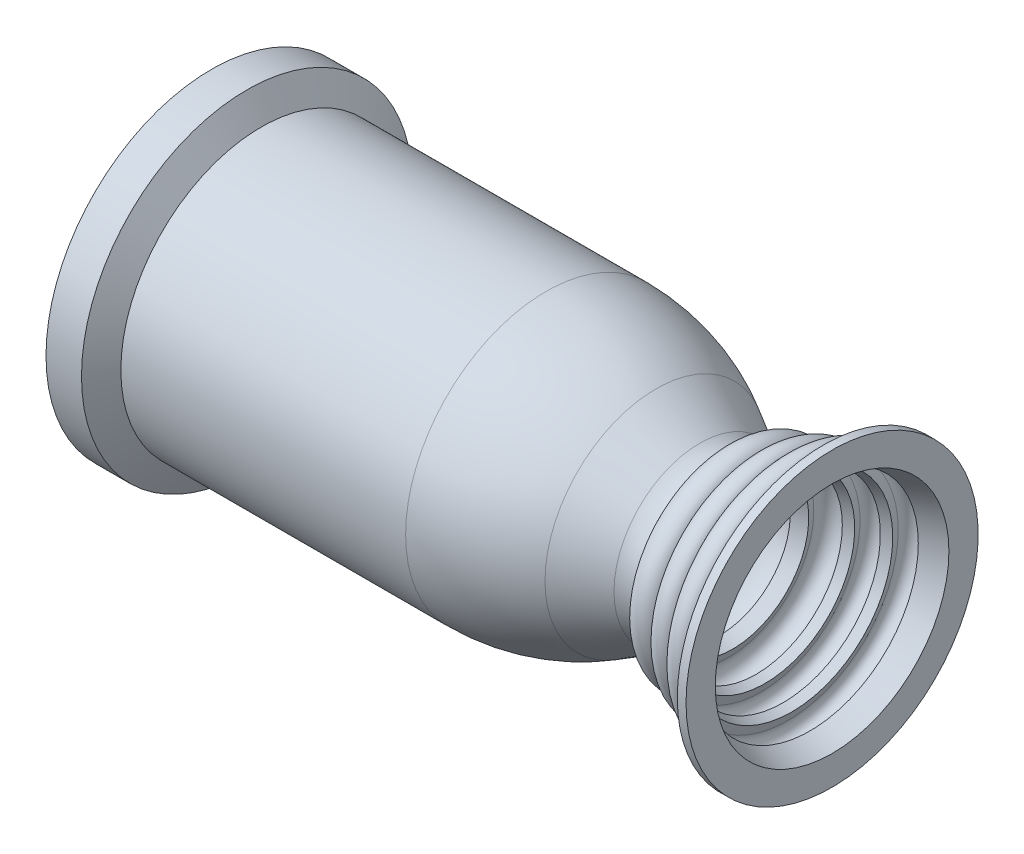
ISO-10303-21;
HEADER;
FILE_DESCRIPTION(('STEP AP214'),'2;1');
FILE_NAME('part.step','',(''),(''),'','','');
FILE_SCHEMA(('AUTOMOTIVE_DESIGN { 1 0 10303 214 1 1 1 1 }'));
ENDSEC;
DATA;
#1=APPLICATION_CONTEXT('core data for automotive mechanical design processes');
#2=APPLICATION_PROTOCOL_DEFINITION('international standard','automotive_design',2000,#1);
#3=PRODUCT_CONTEXT('',#1,'mechanical');
#4=PRODUCT('Part','Part','',(#3));
#5=PRODUCT_RELATED_PRODUCT_CATEGORY('part','',(#4));
#6=PRODUCT_DEFINITION_FORMATION('','',#4);
#7=PRODUCT_DEFINITION_CONTEXT('part definition',#1,'design');
#8=PRODUCT_DEFINITION('design','',#6,#7);
#9=PRODUCT_DEFINITION_SHAPE('','',#8);
#10=(LENGTH_UNIT() NAMED_UNIT(*) SI_UNIT(.MILLI.,.METRE.));
#11=(NAMED_UNIT(*) PLANE_ANGLE_UNIT() SI_UNIT($,.RADIAN.));
#12=(NAMED_UNIT(*) SI_UNIT($,.STERADIAN.) SOLID_ANGLE_UNIT());
#13=UNCERTAINTY_MEASURE_WITH_UNIT(LENGTH_MEASURE(1.E-05),#10,'distance_accuracy_value','');
#14=(GEOMETRIC_REPRESENTATION_CONTEXT(3) GLOBAL_UNCERTAINTY_ASSIGNED_CONTEXT((#13)) GLOBAL_UNIT_ASSIGNED_CONTEXT((#10,
#11,#12)) REPRESENTATION_CONTEXT('',''));
#15=CARTESIAN_POINT('',(0.,0.,0.));
#16=DIRECTION('',(0.,0.,1.));
#17=DIRECTION('',(1.,0.,0.));
#18=AXIS2_PLACEMENT_3D('',#15,#16,#17);
#19=CARTESIAN_POINT('',(233.125452234531,35.6896689820034,0.));
#20=CARTESIAN_POINT('',(235.982927375537,36.9612284286919,0.));
#21=CARTESIAN_POINT('',(241.720728584247,39.4887823874572,0.));
#22=CARTESIAN_POINT('',(253.127754110023,44.4104041223226,0.));
#23=CARTESIAN_POINT('',(267.331680591798,50.3448823112272,0.));
#24=CARTESIAN_POINT('',(284.265598041765,57.1077053295556,0.));
#25=CARTESIAN_POINT('',(301.09514510302,63.5145776102163,0.));
#26=CARTESIAN_POINT('',(317.818383555474,69.5644426879412,0.));
#27=CARTESIAN_POINT('',(334.43732724022,75.2577108387173,0.));
#28=CARTESIAN_POINT('',(348.194959969697,79.7033627843176,0.));
#29=CARTESIAN_POINT('',(359.156425704374,83.0835170429566,0.));
#30=CARTESIAN_POINT('',(364.604957843719,84.7096985060822,0.));
#31=CARTESIAN_POINT('',(367.338810320537,85.5119851472337,0.));
#32=B_SPLINE_CURVE_WITH_KNOTS('',3,(#19,#20,#21,#22,#23,#24,#25,#26,#27,#28,#29,#30,#31),
.UNSPECIFIED.,.F.,.F.,(4,1,1,1,1,1,1,1,1,1,4),(0.49285898927238,0.492966882127899,
0.493074774983417,0.493290560694453,0.493506346405489,0.493722132116525,0.493937917827561,
0.494153703538597,0.494369489249633,0.494477382105151,0.494585274960669),.UNSPECIFIED.);
#33=CARTESIAN_POINT('',(0.,0.,0.));
#34=DIRECTION('',(-1.,0.,0.));
#35=AXIS1_PLACEMENT('',#33,#34);
#36=SURFACE_OF_REVOLUTION('',#32,#35);
#37=CARTESIAN_POINT('',(233.424633520371,0.,0.));
#38=DIRECTION('',(-1.,0.,0.));
#39=DIRECTION('',(0.,0.,1.));
#40=AXIS2_PLACEMENT_3D('',#37,#38,#39);
#41=CIRCLE('',#40,35.8227558713126);
#42=CARTESIAN_POINT('',(233.424633520371,0.,35.8227558713126));
#43=VERTEX_POINT('',#42);
#44=EDGE_CURVE('E276',#43,#43,#41,.T.);
#45=ORIENTED_EDGE('',*,*,#44,.T.);
#46=EDGE_LOOP('',(#45));
#47=FACE_BOUND('',#46,.T.);
#48=CARTESIAN_POINT('',(239.924838451428,0.,0.));
#49=DIRECTION('',(-1.,0.,0.));
#50=DIRECTION('',(0.,0.,1.));
#51=AXIS2_PLACEMENT_3D('',#48,#49,#50);
#52=CIRCLE('',#51,38.6911516360315);
#53=CARTESIAN_POINT('',(239.924838451428,0.,38.6911516360315));
#54=VERTEX_POINT('',#53);
#55=EDGE_CURVE('E44',#54,#54,#52,.T.);
#56=ORIENTED_EDGE('',*,*,#55,.F.);
#57=EDGE_LOOP('',(#56));
#58=FACE_BOUND('',#57,.T.);
#59=ADVANCED_FACE('F40',(#47,#58),#36,.T.);
#60=CARTESIAN_POINT('',(290.485999999995,0.,0.));
#61=DIRECTION('',(-1.,0.,0.));
#62=DIRECTION('',(0.,0.,1.));
#63=AXIS2_PLACEMENT_3D('',#60,#61,#62);
#64=CIRCLE('',#63,59.4599083801213);
#65=CARTESIAN_POINT('',(290.485999999995,0.,59.4599083801213));
#66=VERTEX_POINT('',#65);
#67=EDGE_CURVE('E102',#66,#66,#64,.F.);
#68=ORIENTED_EDGE('',*,*,#67,.T.);
#69=EDGE_LOOP('',(#68));
#70=FACE_BOUND('',#69,.T.);
#71=CARTESIAN_POINT('',(279.267342238557,0.,0.));
#72=DIRECTION('',(-1.,0.,0.));
#73=DIRECTION('',(0.,0.,1.));
#74=AXIS2_PLACEMENT_3D('',#71,#72,#73);
#75=CIRCLE('',#74,55.0918614114358);
#76=CARTESIAN_POINT('',(279.267342238557,0.,55.0918614114358));
#77=VERTEX_POINT('',#76);
#78=EDGE_CURVE('E59',#77,#77,#75,.F.);
#79=ORIENTED_EDGE('',*,*,#78,.F.);
#80=EDGE_LOOP('',(#79));
#81=FACE_BOUND('',#80,.T.);
#82=ADVANCED_FACE('F134',(#70,#81),#36,.T.);
#83=CARTESIAN_POINT('',(365.930866299529,90.3096610047409,0.));
#84=CARTESIAN_POINT('',(363.182392166523,89.5030834373119,0.));
#85=CARTESIAN_POINT('',(357.704525634138,87.8681464069559,0.));
#86=CARTESIAN_POINT('',(346.685594206814,84.470267584355,0.));
#87=CARTESIAN_POINT('',(332.857651733132,80.0018842453295,0.));
#88=CARTESIAN_POINT('',(316.156963456676,74.2805967310784,0.));
#89=CARTESIAN_POINT('',(299.354503112531,68.2020578559153,0.));
#90=CARTESIAN_POINT('',(282.448229164497,61.7659625675687,0.));
#91=CARTESIAN_POINT('',(265.440009785951,54.9734520203751,0.));
#92=CARTESIAN_POINT('',(251.17618296527,49.0139375616419,0.));
#93=CARTESIAN_POINT('',(239.722323486587,44.0721059218443,0.));
#94=CARTESIAN_POINT('',(233.961623923531,41.5344647429335,0.));
#95=CARTESIAN_POINT('',(231.092663567,40.2577944436296,0.));
#96=B_SPLINE_CURVE_WITH_KNOTS('',3,(#83,#84,#85,#86,#87,#88,#89,#90,#91,#92,#93,#94,#95),
.UNSPECIFIED.,.F.,.F.,(4,1,1,1,1,1,1,1,1,1,4),(0.49285898927238,0.492966882127899,
0.493074774983417,0.493290560694453,0.493506346405489,0.493722132116525,0.493937917827561,
0.494153703538597,0.494369489249633,0.494477382105151,0.494585274960669),.UNSPECIFIED.);
#97=CARTESIAN_POINT('',(0.,0.,0.));
#98=DIRECTION('',(-1.,0.,0.));
#99=AXIS1_PLACEMENT('',#97,#98);
#100=SURFACE_OF_REVOLUTION('',#96,#99);
#101=CARTESIAN_POINT('',(267.198650557136,0.,0.));
#102=DIRECTION('',(-1.,0.,0.));
#103=DIRECTION('',(0.,0.,1.));
#104=AXIS2_PLACEMENT_3D('',#101,#102,#103);
#105=CIRCLE('',#104,55.6379157311504);
#106=CARTESIAN_POINT('',(267.198650557136,0.,55.6379157311504));
#107=VERTEX_POINT('',#106);
#108=EDGE_CURVE('E181',#107,#107,#105,.F.);
#109=ORIENTED_EDGE('',*,*,#108,.F.);
#110=EDGE_LOOP('',(#109));
#111=FACE_BOUND('',#110,.T.);
#112=CARTESIAN_POINT('',(264.527335894684,0.,0.));
#113=DIRECTION('',(-1.,0.,0.));
#114=DIRECTION('',(0.,0.,1.));
#115=AXIS2_PLACEMENT_3D('',#112,#113,#114);
#116=CIRCLE('',#115,54.5476496710882);
#117=CARTESIAN_POINT('',(264.527335894684,0.,54.5476496710882));
#118=VERTEX_POINT('',#117);
#119=EDGE_CURVE('E11',#118,#118,#116,.T.);
#120=ORIENTED_EDGE('',*,*,#119,.F.);
#121=EDGE_LOOP('',(#120));
#122=FACE_BOUND('',#121,.T.);
#123=ADVANCED_FACE('F193',(#111,#122),#100,.T.);
#124=CARTESIAN_POINT('',(250.795524753858,0.,0.));
#125=DIRECTION('',(-1.,0.,0.));
#126=DIRECTION('',(0.,0.,1.));
#127=AXIS2_PLACEMENT_3D('',#124,#125,#126);
#128=CIRCLE('',#127,48.8221595564271);
#129=CARTESIAN_POINT('',(250.795524753858,0.,48.8221595564271));
#130=VERTEX_POINT('',#129);
#131=EDGE_CURVE('E177',#130,#130,#128,.T.);
#132=ORIENTED_EDGE('',*,*,#131,.F.);
#133=EDGE_LOOP('',(#132));
#134=FACE_BOUND('',#133,.T.);
#135=CARTESIAN_POINT('',(253.446015059644,0.,0.));
#136=DIRECTION('',(-1.,0.,0.));
#137=DIRECTION('',(0.,0.,1.));
#138=AXIS2_PLACEMENT_3D('',#135,#136,#137);
#139=CIRCLE('',#138,49.9429757346222);
#140=CARTESIAN_POINT('',(253.446015059644,0.,49.9429757346222));
#141=VERTEX_POINT('',#140);
#142=EDGE_CURVE('E49',#141,#141,#139,.F.);
#143=ORIENTED_EDGE('',*,*,#142,.F.);
#144=EDGE_LOOP('',(#143));
#145=FACE_BOUND('',#144,.T.);
#146=ADVANCED_FACE('F191',(#134,#145),#100,.T.);
#147=CARTESIAN_POINT('',(286.040999999992,0.,0.));
#148=DIRECTION('',(-1.,0.,0.));
#149=DIRECTION('',(0.,0.,1.));
#150=AXIS2_PLACEMENT_3D('',#147,#148,#149);
#151=CIRCLE('',#150,63.1073905631425);
#152=CARTESIAN_POINT('',(286.040999999992,0.,63.1073905631425));
#153=VERTEX_POINT('',#152);
#154=EDGE_CURVE('E163',#153,#153,#151,.F.);
#155=ORIENTED_EDGE('',*,*,#154,.F.);
#156=EDGE_LOOP('',(#155));
#157=FACE_BOUND('',#156,.T.);
#158=CARTESIAN_POINT('',(278.337884607887,0.,0.));
#159=DIRECTION('',(-1.,0.,0.));
#160=DIRECTION('',(0.,0.,1.));
#161=AXIS2_PLACEMENT_3D('',#158,#159,#160);
#162=CIRCLE('',#161,60.1007041181964);
#163=CARTESIAN_POINT('',(278.337884607887,0.,60.1007041181964));
#164=VERTEX_POINT('',#163);
#165=EDGE_CURVE('E55',#164,#164,#162,.T.);
#166=ORIENTED_EDGE('',*,*,#165,.F.);
#167=EDGE_LOOP('',(#166));
#168=FACE_BOUND('',#167,.T.);
#169=ADVANCED_FACE('F137',(#157,#168),#100,.T.);
#170=CARTESIAN_POINT('',(232.44877237473,0.,0.));
#171=DIRECTION('',(-1.,0.,0.));
#172=DIRECTION('',(0.,0.,1.));
#173=AXIS2_PLACEMENT_3D('',#170,#171,#172);
#174=CIRCLE('',#173,40.8602983182315);
#175=CARTESIAN_POINT('',(232.44877237473,0.,40.8602983182315));
#176=VERTEX_POINT('',#175);
#177=EDGE_CURVE('E274',#176,#176,#174,.T.);
#178=ORIENTED_EDGE('',*,*,#177,.F.);
#179=EDGE_LOOP('',(#178));
#180=FACE_BOUND('',#179,.T.);
#181=CARTESIAN_POINT('',(237.027726240929,0.,0.));
#182=DIRECTION('',(-1.,0.,0.));
#183=DIRECTION('',(0.,0.,1.));
#184=AXIS2_PLACEMENT_3D('',#181,#182,#183);
#185=CIRCLE('',#184,42.88049243525);
#186=CARTESIAN_POINT('',(237.027726240929,0.,42.88049243525));
#187=VERTEX_POINT('',#186);
#188=EDGE_CURVE('E168',#187,#187,#185,.F.);
#189=ORIENTED_EDGE('',*,*,#188,.F.);
#190=EDGE_LOOP('',(#189));
#191=FACE_BOUND('',#190,.T.);
#192=ADVANCED_FACE('F153',(#180,#191),#100,.T.);
#193=CARTESIAN_POINT('',(0.,0.,0.));
#194=DIRECTION('',(-1.,0.,0.));
#195=DIRECTION('',(0.,0.,1.));
#196=AXIS2_PLACEMENT_3D('',#193,#194,#195);
#197=CYLINDRICAL_SURFACE('',#196,66.5011717000006);
#198=CARTESIAN_POINT('',(144.934660600002,0.,0.));
#199=DIRECTION('',(-1.,0.,0.));
#200=DIRECTION('',(0.,0.,1.));
#201=AXIS2_PLACEMENT_3D('',#198,#199,#200);
#202=CIRCLE('',#201,66.5011717000013);
#203=CARTESIAN_POINT('',(144.934660600002,0.,66.5011717000013));
#204=VERTEX_POINT('',#203);
#205=EDGE_CURVE('E161',#204,#204,#202,.T.);
#206=ORIENTED_EDGE('',*,*,#205,.F.);
#207=EDGE_LOOP('',(#206));
#208=FACE_BOUND('',#207,.T.);
#209=CARTESIAN_POINT('',(-25.4,0.,0.));
#210=DIRECTION('',(-1.,0.,0.));
#211=DIRECTION('',(0.,0.,1.));
#212=AXIS2_PLACEMENT_3D('',#209,#210,#211);
#213=CIRCLE('',#212,66.5011717);
#214=CARTESIAN_POINT('',(-25.4,0.,66.5011717));
#215=VERTEX_POINT('',#214);
#216=EDGE_CURVE('E114',#215,#215,#213,.T.);
#217=ORIENTED_EDGE('',*,*,#216,.T.);
#218=EDGE_LOOP('',(#217));
#219=FACE_BOUND('',#218,.T.);
#220=ADVANCED_FACE('F42',(#208,#219),#197,.F.);
#221=CARTESIAN_POINT('',(144.934590184679,0.,0.));
#222=DIRECTION('',(-1.,0.,0.));
#223=DIRECTION('',(0.,0.,1.));
#224=AXIS2_PLACEMENT_3D('',#221,#222,#223);
#225=DEGENERATE_TOROIDAL_SURFACE('',#224,40.3835742999741,106.884745999999,.F.);
#226=CARTESIAN_POINT('',(198.37703916855,0.,0.));
#227=DIRECTION('',(-1.,0.,0.));
#228=DIRECTION('',(0.,0.,1.));
#229=AXIS2_PLACEMENT_3D('',#226,#227,#228);
#230=CIRCLE('',#229,52.1812871437227);
#231=CARTESIAN_POINT('',(198.37703916855,0.,52.1812871437227));
#232=VERTEX_POINT('',#231);
#233=EDGE_CURVE('E158',#232,#232,#230,.T.);
#234=ORIENTED_EDGE('',*,*,#233,.F.);
#235=EDGE_LOOP('',(#234));
#236=FACE_BOUND('',#235,.T.);
#237=ORIENTED_EDGE('',*,*,#205,.T.);
#238=EDGE_LOOP('',(#237));
#239=FACE_BOUND('',#238,.T.);
#240=ADVANCED_FACE('F146',(#236,#239),#225,.T.);
#241=CARTESIAN_POINT('',(198.37703916855,0.,0.));
#242=DIRECTION('',(-1.,0.,0.));
#243=DIRECTION('',(0.,0.,1.));
#244=AXIS2_PLACEMENT_3D('',#241,#242,#243);
#245=CONICAL_SURFACE('',#244,52.1812871437227,0.523599596470061);
#246=CARTESIAN_POINT('',(220.627157517244,0.,0.));
#247=DIRECTION('',(-1.,0.,0.));
#248=DIRECTION('',(0.,0.,1.));
#249=AXIS2_PLACEMENT_3D('',#246,#247,#248);
#250=CIRCLE('',#249,39.3351509729336);
#251=CARTESIAN_POINT('',(220.627157517244,0.,39.3351509729336));
#252=VERTEX_POINT('',#251);
#253=EDGE_CURVE('E170',#252,#252,#250,.T.);
#254=ORIENTED_EDGE('',*,*,#253,.F.);
#255=EDGE_LOOP('',(#254));
#256=FACE_BOUND('',#255,.T.);
#257=ORIENTED_EDGE('',*,*,#233,.T.);
#258=EDGE_LOOP('',(#257));
#259=FACE_BOUND('',#258,.T.);
#260=ADVANCED_FACE('F143',(#256,#259),#245,.F.);
#261=CARTESIAN_POINT('',(233.742807352704,0.,0.));
#262=DIRECTION('',(-1.,0.,0.));
#263=DIRECTION('',(0.,0.,1.));
#264=AXIS2_PLACEMENT_3D('',#261,#262,#263);
#265=TOROIDAL_SURFACE('',#264,62.0521463362453,26.2313200000138);
#266=ORIENTED_EDGE('',*,*,#44,.F.);
#267=EDGE_LOOP('',(#266));
#268=FACE_BOUND('',#267,.T.);
#269=ORIENTED_EDGE('',*,*,#253,.T.);
#270=EDGE_LOOP('',(#269));
#271=FACE_BOUND('',#270,.T.);
#272=ADVANCED_FACE('F139',(#268,#271),#265,.T.);
#273=CARTESIAN_POINT('',(233.742807352704,0.,0.));
#274=DIRECTION('',(-1.,0.,0.));
#275=DIRECTION('',(0.,0.,1.));
#276=AXIS2_PLACEMENT_3D('',#273,#274,#275);
#277=TOROIDAL_SURFACE('',#276,62.0521463362453,21.2313200000098);
#278=CARTESIAN_POINT('',(223.12715488075,0.,0.));
#279=DIRECTION('',(-1.,0.,0.));
#280=DIRECTION('',(0.,0.,1.));
#281=AXIS2_PLACEMENT_3D('',#278,#279,#280);
#282=CIRCLE('',#281,43.6652795140459);
#283=CARTESIAN_POINT('',(223.12715488075,0.,43.6652795140459));
#284=VERTEX_POINT('',#283);
#285=EDGE_CURVE('E271',#284,#284,#282,.T.);
#286=ORIENTED_EDGE('',*,*,#285,.F.);
#287=EDGE_LOOP('',(#286));
#288=FACE_BOUND('',#287,.T.);
#289=ORIENTED_EDGE('',*,*,#177,.T.);
#290=EDGE_LOOP('',(#289));
#291=FACE_BOUND('',#290,.T.);
#292=ADVANCED_FACE('F142',(#288,#291),#277,.F.);
#293=CARTESIAN_POINT('',(223.12715488075,0.,0.));
#294=DIRECTION('',(-1.,0.,0.));
#295=DIRECTION('',(0.,0.,1.));
#296=AXIS2_PLACEMENT_3D('',#293,#294,#295);
#297=CONICAL_SURFACE('',#296,43.6652795140459,0.52359959646985);
#298=CARTESIAN_POINT('',(200.877042723027,0.,0.));
#299=DIRECTION('',(-1.,0.,0.));
#300=DIRECTION('',(0.,0.,1.));
#301=AXIS2_PLACEMENT_3D('',#298,#299,#300);
#302=CIRCLE('',#301,56.5114121104639);
#303=CARTESIAN_POINT('',(200.877042723027,0.,56.5114121104639));
#304=VERTEX_POINT('',#303);
#305=EDGE_CURVE('E282',#304,#304,#302,.T.);
#306=ORIENTED_EDGE('',*,*,#305,.F.);
#307=EDGE_LOOP('',(#306));
#308=FACE_BOUND('',#307,.T.);
#309=ORIENTED_EDGE('',*,*,#285,.T.);
#310=EDGE_LOOP('',(#309));
#311=FACE_BOUND('',#310,.T.);
#312=ADVANCED_FACE('F260',(#308,#311),#297,.T.);
#313=CARTESIAN_POINT('',(144.934590184679,0.,0.));
#314=DIRECTION('',(-1.,0.,0.));
#315=DIRECTION('',(0.,0.,1.));
#316=AXIS2_PLACEMENT_3D('',#313,#314,#315);
#317=DEGENERATE_TOROIDAL_SURFACE('',#316,40.3835742999741,111.884745999999,.F.);
#318=CARTESIAN_POINT('',(144.934666474999,0.,0.));
#319=DIRECTION('',(-1.,0.,0.));
#320=DIRECTION('',(0.,0.,1.));
#321=AXIS2_PLACEMENT_3D('',#318,#319,#320);
#322=CIRCLE('',#321,71.5011716999978);
#323=CARTESIAN_POINT('',(144.934666474999,0.,71.5011716999978));
#324=VERTEX_POINT('',#323);
#325=EDGE_CURVE('E293',#324,#324,#322,.T.);
#326=ORIENTED_EDGE('',*,*,#325,.F.);
#327=EDGE_LOOP('',(#326));
#328=FACE_BOUND('',#327,.T.);
#329=ORIENTED_EDGE('',*,*,#305,.T.);
#330=EDGE_LOOP('',(#329));
#331=FACE_BOUND('',#330,.T.);
#332=ADVANCED_FACE('F256',(#328,#331),#317,.F.);
#333=CARTESIAN_POINT('',(0.,0.,0.));
#334=DIRECTION('',(-1.,0.,0.));
#335=DIRECTION('',(0.,0.,1.));
#336=AXIS2_PLACEMENT_3D('',#333,#334,#335);
#337=CYLINDRICAL_SURFACE('',#336,71.5011716999989);
#338=CARTESIAN_POINT('',(0.,0.,0.));
#339=DIRECTION('',(-1.,0.,0.));
#340=DIRECTION('',(0.,0.,1.));
#341=AXIS2_PLACEMENT_3D('',#338,#339,#340);
#342=CIRCLE('',#341,71.5011717);
#343=CARTESIAN_POINT('',(0.,0.,71.5011717));
#344=VERTEX_POINT('',#343);
#345=EDGE_CURVE('E118',#344,#344,#342,.T.);
#346=ORIENTED_EDGE('',*,*,#345,.F.);
#347=EDGE_LOOP('',(#346));
#348=FACE_BOUND('',#347,.T.);
#349=ORIENTED_EDGE('',*,*,#325,.T.);
#350=EDGE_LOOP('',(#349));
#351=FACE_BOUND('',#350,.T.);
#352=ADVANCED_FACE('F252',(#348,#351),#337,.T.);
#353=CARTESIAN_POINT('',(-25.4,66.5011717,0.));
#354=DIRECTION('',(1.,0.,0.));
#355=DIRECTION('',(0.,0.,-1.));
#356=AXIS2_PLACEMENT_3D('',#353,#354,#355);
#357=PLANE('',#356);
#358=ORIENTED_EDGE('',*,*,#216,.F.);
#359=EDGE_LOOP('',(#358));
#360=FACE_BOUND('',#359,.T.);
#361=CARTESIAN_POINT('',(-25.4,0.,0.));
#362=DIRECTION('',(-1.,0.,0.));
#363=DIRECTION('',(0.,0.,1.));
#364=AXIS2_PLACEMENT_3D('',#361,#362,#363);
#365=CIRCLE('',#364,84.2011716999999);
#366=CARTESIAN_POINT('',(-25.4,0.,84.2011716999999));
#367=VERTEX_POINT('',#366);
#368=EDGE_CURVE('E110',#367,#367,#365,.T.);
#369=ORIENTED_EDGE('',*,*,#368,.T.);
#370=EDGE_LOOP('',(#369));
#371=FACE_BOUND('',#370,.T.);
#372=ADVANCED_FACE('F248',(#360,#371),#357,.F.);
#373=CARTESIAN_POINT('',(0.,0.,0.));
#374=DIRECTION('',(-1.,0.,0.));
#375=DIRECTION('',(0.,0.,1.));
#376=AXIS2_PLACEMENT_3D('',#373,#374,#375);
#377=CYLINDRICAL_SURFACE('',#376,84.2011716999999);
#378=ORIENTED_EDGE('',*,*,#368,.F.);
#379=EDGE_LOOP('',(#378));
#380=FACE_BOUND('',#379,.T.);
#381=CARTESIAN_POINT('',(-7.3323484187082,0.,0.));
#382=DIRECTION('',(-1.,0.,0.));
#383=DIRECTION('',(0.,0.,1.));
#384=AXIS2_PLACEMENT_3D('',#381,#382,#383);
#385=CIRCLE('',#384,84.2011716999999);
#386=CARTESIAN_POINT('',(-7.3323484187082,0.,84.2011716999999));
#387=VERTEX_POINT('',#386);
#388=EDGE_CURVE('E106',#387,#387,#385,.T.);
#389=ORIENTED_EDGE('',*,*,#388,.T.);
#390=EDGE_LOOP('',(#389));
#391=FACE_BOUND('',#390,.T.);
#392=ADVANCED_FACE('F244',(#380,#391),#377,.T.);
#393=CARTESIAN_POINT('',(0.,0.,0.));
#394=DIRECTION('',(-1.,0.,0.));
#395=DIRECTION('',(0.,0.,1.));
#396=AXIS2_PLACEMENT_3D('',#393,#394,#395);
#397=CONICAL_SURFACE('',#396,71.5011717,1.0471975511966);
#398=ORIENTED_EDGE('',*,*,#388,.F.);
#399=EDGE_LOOP('',(#398));
#400=FACE_BOUND('',#399,.T.);
#401=ORIENTED_EDGE('',*,*,#345,.T.);
#402=EDGE_LOOP('',(#401));
#403=FACE_BOUND('',#402,.T.);
#404=ADVANCED_FACE('F240',(#400,#403),#397,.T.);
#405=CARTESIAN_POINT('',(290.486,95.,-90.3096610047409));
#406=DIRECTION('',(-1.,0.,0.));
#407=DIRECTION('',(0.,0.,1.));
#408=AXIS2_PLACEMENT_3D('',#405,#406,#407);
#409=PLANE('',#408);
#410=ORIENTED_EDGE('',*,*,#67,.F.);
#411=EDGE_LOOP('',(#410));
#412=FACE_BOUND('',#411,.T.);
#413=CARTESIAN_POINT('',(290.485999999996,0.,0.));
#414=DIRECTION('',(-1.,0.,0.));
#415=DIRECTION('',(0.,0.,1.));
#416=AXIS2_PLACEMENT_3D('',#413,#414,#415);
#417=CIRCLE('',#416,74.3445586017707);
#418=CARTESIAN_POINT('',(290.485999999996,0.,74.3445586017707));
#419=VERTEX_POINT('',#418);
#420=EDGE_CURVE('E87',#419,#419,#417,.T.);
#421=ORIENTED_EDGE('',*,*,#420,.F.);
#422=EDGE_LOOP('',(#421));
#423=FACE_BOUND('',#422,.T.);
#424=ADVANCED_FACE('F236',(#412,#423),#409,.F.);
#425=CARTESIAN_POINT('',(286.040999999996,74.3445586017707,0.));
#426=DIRECTION('',(1.,0.,0.));
#427=DIRECTION('',(0.,0.,-1.));
#428=AXIS2_PLACEMENT_3D('',#425,#426,#427);
#429=PLANE('',#428);
#430=ORIENTED_EDGE('',*,*,#154,.T.);
#431=EDGE_LOOP('',(#430));
#432=FACE_BOUND('',#431,.T.);
#433=CARTESIAN_POINT('',(286.040999999996,0.,0.));
#434=DIRECTION('',(-1.,0.,0.));
#435=DIRECTION('',(0.,0.,1.));
#436=AXIS2_PLACEMENT_3D('',#433,#434,#435);
#437=CIRCLE('',#436,74.3445586017707);
#438=CARTESIAN_POINT('',(286.040999999996,0.,74.3445586017707));
#439=VERTEX_POINT('',#438);
#440=EDGE_CURVE('E93',#439,#439,#437,.T.);
#441=ORIENTED_EDGE('',*,*,#440,.T.);
#442=EDGE_LOOP('',(#441));
#443=FACE_BOUND('',#442,.T.);
#444=ADVANCED_FACE('F232',(#432,#443),#429,.F.);
#445=CARTESIAN_POINT('',(0.,0.,0.));
#446=DIRECTION('',(-1.,0.,0.));
#447=DIRECTION('',(0.,0.,1.));
#448=AXIS2_PLACEMENT_3D('',#445,#446,#447);
#449=CYLINDRICAL_SURFACE('',#448,74.3445586017707);
#450=ORIENTED_EDGE('',*,*,#440,.F.);
#451=EDGE_LOOP('',(#450));
#452=FACE_BOUND('',#451,.T.);
#453=ORIENTED_EDGE('',*,*,#420,.T.);
#454=EDGE_LOOP('',(#453));
#455=FACE_BOUND('',#454,.T.);
#456=ADVANCED_FACE('F228',(#452,#455),#449,.T.);
#457=CARTESIAN_POINT('',(237.023320853688,0.,0.));
#458=DIRECTION('',(1.,0.,0.));
#459=DIRECTION('',(0.,0.,-1.));
#460=AXIS2_PLACEMENT_3D('',#457,#458,#459);
#461=CONICAL_SURFACE('',#460,42.8785912348144,0.407416083392834);
#462=CARTESIAN_POINT('',(237.023320853688,0.,0.));
#463=DIRECTION('',(-1.,0.,0.));
#464=DIRECTION('',(0.,0.,1.));
#465=AXIS2_PLACEMENT_3D('',#462,#463,#464);
#466=CIRCLE('',#465,42.8785912348144);
#467=CARTESIAN_POINT('',(237.023320853688,0.,42.8785912348144));
#468=VERTEX_POINT('',#467);
#469=EDGE_CURVE('E82',#468,#468,#466,.T.);
#470=ORIENTED_EDGE('',*,*,#469,.T.);
#471=EDGE_LOOP('',(#470));
#472=FACE_BOUND('',#471,.T.);
#473=ORIENTED_EDGE('',*,*,#188,.T.);
#474=EDGE_LOOP('',(#473));
#475=FACE_BOUND('',#474,.T.);
#476=ADVANCED_FACE('F222',(#472,#475),#461,.F.);
#477=CARTESIAN_POINT('',(243.912619344699,0.,0.));
#478=DIRECTION('',(-1.,0.,0.));
#479=DIRECTION('',(0.,0.,1.));
#480=AXIS2_PLACEMENT_3D('',#477,#478,#479);
#481=TOROIDAL_SURFACE('',#480,45.8429741894528,7.50000000000001);
#482=ORIENTED_EDGE('',*,*,#469,.F.);
#483=EDGE_LOOP('',(#482));
#484=FACE_BOUND('',#483,.T.);
#485=ORIENTED_EDGE('',*,*,#131,.T.);
#486=EDGE_LOOP('',(#485));
#487=FACE_BOUND('',#486,.T.);
#488=ADVANCED_FACE('F213',(#484,#487),#481,.T.);
#489=CARTESIAN_POINT('',(272.762432849766,0.,0.));
#490=DIRECTION('',(-1.,0.,0.));
#491=DIRECTION('',(0.,0.,1.));
#492=AXIS2_PLACEMENT_3D('',#489,#490,#491);
#493=TOROIDAL_SURFACE('',#492,57.8838735669546,5.99999999999955);
#494=ORIENTED_EDGE('',*,*,#108,.T.);
#495=EDGE_LOOP('',(#494));
#496=FACE_BOUND('',#495,.T.);
#497=ORIENTED_EDGE('',*,*,#165,.T.);
#498=EDGE_LOOP('',(#497));
#499=FACE_BOUND('',#498,.T.);
#500=ADVANCED_FACE('F188',(#496,#499),#493,.T.);
#501=CARTESIAN_POINT('',(258.993610416145,0.,0.));
#502=DIRECTION('',(-1.,0.,0.));
#503=DIRECTION('',(0.,0.,1.));
#504=AXIS2_PLACEMENT_3D('',#501,#502,#503);
#505=TOROIDAL_SURFACE('',#504,52.2286235116404,5.99999999999999);
#506=ORIENTED_EDGE('',*,*,#142,.T.);
#507=EDGE_LOOP('',(#506));
#508=FACE_BOUND('',#507,.T.);
#509=ORIENTED_EDGE('',*,*,#119,.T.);
#510=EDGE_LOOP('',(#509));
#511=FACE_BOUND('',#510,.T.);
#512=ADVANCED_FACE('F212',(#508,#511),#505,.T.);
#513=CARTESIAN_POINT('',(268.126923234822,0.,0.));
#514=DIRECTION('',(-1.,0.,0.));
#515=DIRECTION('',(0.,0.,1.));
#516=AXIS2_PLACEMENT_3D('',#513,#514,#515);
#517=CONICAL_SURFACE('',#516,56.0098160348082,1.18974100398241);
#518=CARTESIAN_POINT('',(268.126923234822,0.,0.));
#519=DIRECTION('',(-1.,0.,0.));
#520=DIRECTION('',(0.,0.,1.));
#521=AXIS2_PLACEMENT_3D('',#518,#519,#520);
#522=CIRCLE('',#521,56.0098160348082);
#523=CARTESIAN_POINT('',(268.126923234822,0.,56.0098160348082));
#524=VERTEX_POINT('',#523);
#525=EDGE_CURVE('E96',#524,#524,#522,.T.);
#526=ORIENTED_EDGE('',*,*,#525,.F.);
#527=EDGE_LOOP('',(#526));
#528=FACE_BOUND('',#527,.T.);
#529=CARTESIAN_POINT('',(269.984665697448,0.,0.));
#530=DIRECTION('',(-1.,0.,0.));
#531=DIRECTION('',(0.,0.,1.));
#532=AXIS2_PLACEMENT_3D('',#529,#530,#531);
#533=CIRCLE('',#532,51.3728432943394);
#534=CARTESIAN_POINT('',(269.984665697448,0.,51.3728432943394));
#535=VERTEX_POINT('',#534);
#536=EDGE_CURVE('E63',#535,#535,#533,.T.);
#537=ORIENTED_EDGE('',*,*,#536,.T.);
#538=EDGE_LOOP('',(#537));
#539=FACE_BOUND('',#538,.T.);
#540=ADVANCED_FACE('F219',(#528,#539),#517,.T.);
#541=CARTESIAN_POINT('',(279.433108668306,0.,0.));
#542=DIRECTION('',(-1.,0.,0.));
#543=DIRECTION('',(0.,0.,1.));
#544=AXIS2_PLACEMENT_3D('',#541,#542,#543);
#545=CONICAL_SURFACE('',#544,54.6781041595618,1.18974100398241);
#546=CARTESIAN_POINT('',(277.4096119302,0.,0.));
#547=DIRECTION('',(-1.,0.,0.));
#548=DIRECTION('',(0.,0.,1.));
#549=AXIS2_PLACEMENT_3D('',#546,#547,#548);
#550=CIRCLE('',#549,59.7288038145382);
#551=CARTESIAN_POINT('',(277.4096119302,0.,59.7288038145382));
#552=VERTEX_POINT('',#551);
#553=EDGE_CURVE('E506',#552,#552,#550,.T.);
#554=ORIENTED_EDGE('',*,*,#553,.T.);
#555=EDGE_LOOP('',(#554));
#556=FACE_BOUND('',#555,.T.);
#557=ORIENTED_EDGE('',*,*,#78,.T.);
#558=EDGE_LOOP('',(#557));
#559=FACE_BOUND('',#558,.T.);
#560=ADVANCED_FACE('F391',(#556,#559),#545,.F.);
#561=CARTESIAN_POINT('',(272.768267582511,0.,0.));
#562=DIRECTION('',(-1.,0.,0.));
#563=DIRECTION('',(0.,0.,1.));
#564=AXIS2_PLACEMENT_3D('',#561,#562,#563);
#565=TOROIDAL_SURFACE('',#564,57.8693099246734,4.99997948798491);
#566=ORIENTED_EDGE('',*,*,#525,.T.);
#567=EDGE_LOOP('',(#566));
#568=FACE_BOUND('',#567,.T.);
#569=ORIENTED_EDGE('',*,*,#553,.F.);
#570=EDGE_LOOP('',(#569));
#571=FACE_BOUND('',#570,.T.);
#572=ADVANCED_FACE('F401',(#568,#571),#565,.F.);
#573=ORIENTED_EDGE('',*,*,#536,.F.);
#574=EDGE_LOOP('',(#573));
#575=FACE_BOUND('',#574,.T.);
#576=CARTESIAN_POINT('',(265.520740354869,0.,0.));
#577=DIRECTION('',(-1.,0.,0.));
#578=DIRECTION('',(0.,0.,1.));
#579=AXIS2_PLACEMENT_3D('',#576,#577,#578);
#580=CIRCLE('',#579,49.5509486185235);
#581=CARTESIAN_POINT('',(265.520740354869,0.,49.5509486185235));
#582=VERTEX_POINT('',#581);
#583=EDGE_CURVE('E68',#582,#582,#580,.F.);
#584=ORIENTED_EDGE('',*,*,#583,.F.);
#585=EDGE_LOOP('',(#584));
#586=FACE_BOUND('',#585,.T.);
#587=ADVANCED_FACE('F207',(#575,#586),#36,.T.);
#588=CARTESIAN_POINT('',(254.369462651722,0.,0.));
#589=DIRECTION('',(-1.,0.,0.));
#590=DIRECTION('',(0.,0.,1.));
#591=AXIS2_PLACEMENT_3D('',#588,#589,#590);
#592=CONICAL_SURFACE('',#591,50.3267003034018,1.17697006378601);
#593=CARTESIAN_POINT('',(254.369462651722,0.,0.));
#594=DIRECTION('',(-1.,0.,0.));
#595=DIRECTION('',(0.,0.,1.));
#596=AXIS2_PLACEMENT_3D('',#593,#594,#595);
#597=CIRCLE('',#596,50.3267003034018);
#598=CARTESIAN_POINT('',(254.369462651722,0.,50.3267003034018));
#599=VERTEX_POINT('',#598);
#600=EDGE_CURVE('E495',#599,#599,#597,.T.);
#601=ORIENTED_EDGE('',*,*,#600,.F.);
#602=EDGE_LOOP('',(#601));
#603=FACE_BOUND('',#602,.T.);
#604=CARTESIAN_POINT('',(256.286327448979,0.,0.));
#605=DIRECTION('',(-1.,0.,0.));
#606=DIRECTION('',(0.,0.,1.));
#607=AXIS2_PLACEMENT_3D('',#604,#605,#606);
#608=CIRCLE('',#607,45.7136931482958);
#609=CARTESIAN_POINT('',(256.286327448979,0.,45.7136931482958));
#610=VERTEX_POINT('',#609);
#611=EDGE_CURVE('E72',#610,#610,#608,.T.);
#612=ORIENTED_EDGE('',*,*,#611,.T.);
#613=EDGE_LOOP('',(#612));
#614=FACE_BOUND('',#613,.T.);
#615=ADVANCED_FACE('F419',(#603,#614),#592,.T.);
#616=CARTESIAN_POINT('',(265.522511146504,0.,0.));
#617=DIRECTION('',(-1.,0.,0.));
#618=DIRECTION('',(0.,0.,1.));
#619=AXIS2_PLACEMENT_3D('',#616,#617,#618);
#620=CONICAL_SURFACE('',#619,49.5466871419178,1.17697006378604);
#621=CARTESIAN_POINT('',(263.603888302606,0.,0.));
#622=DIRECTION('',(-1.,0.,0.));
#623=DIRECTION('',(0.,0.,1.));
#624=AXIS2_PLACEMENT_3D('',#621,#622,#623);
#625=CIRCLE('',#624,54.1639251023085);
#626=CARTESIAN_POINT('',(263.603888302606,0.,54.1639251023085));
#627=VERTEX_POINT('',#626);
#628=EDGE_CURVE('E501',#627,#627,#625,.T.);
#629=ORIENTED_EDGE('',*,*,#628,.T.);
#630=EDGE_LOOP('',(#629));
#631=FACE_BOUND('',#630,.T.);
#632=ORIENTED_EDGE('',*,*,#583,.T.);
#633=EDGE_LOOP('',(#632));
#634=FACE_BOUND('',#633,.T.);
#635=ADVANCED_FACE('F427',(#631,#634),#620,.F.);
#636=CARTESIAN_POINT('',(258.986675477164,0.,0.));
#637=DIRECTION('',(-1.,0.,0.));
#638=DIRECTION('',(0.,0.,1.));
#639=AXIS2_PLACEMENT_3D('',#636,#637,#638);
#640=TOROIDAL_SURFACE('',#639,52.2453127028553,4.99997278140223);
#641=ORIENTED_EDGE('',*,*,#600,.T.);
#642=EDGE_LOOP('',(#641));
#643=FACE_BOUND('',#642,.T.);
#644=ORIENTED_EDGE('',*,*,#628,.F.);
#645=EDGE_LOOP('',(#644));
#646=FACE_BOUND('',#645,.T.);
#647=ADVANCED_FACE('F437',(#643,#646),#640,.F.);
#648=ORIENTED_EDGE('',*,*,#611,.F.);
#649=EDGE_LOOP('',(#648));
#650=FACE_BOUND('',#649,.T.);
#651=CARTESIAN_POINT('',(251.856321452605,0.,0.));
#652=DIRECTION('',(-1.,0.,0.));
#653=DIRECTION('',(0.,0.,1.));
#654=AXIS2_PLACEMENT_3D('',#651,#652,#653);
#655=CIRCLE('',#654,43.8403887326385);
#656=CARTESIAN_POINT('',(251.856321452605,0.,43.8403887326385));
#657=VERTEX_POINT('',#656);
#658=EDGE_CURVE('E75',#657,#657,#655,.F.);
#659=ORIENTED_EDGE('',*,*,#658,.F.);
#660=EDGE_LOOP('',(#659));
#661=FACE_BOUND('',#660,.T.);
#662=ADVANCED_FACE('F136',(#650,#661),#36,.T.);
#663=CARTESIAN_POINT('',(237.945873974228,0.,0.));
#664=DIRECTION('',(-1.,0.,0.));
#665=DIRECTION('',(0.,0.,1.));
#666=AXIS2_PLACEMENT_3D('',#663,#664,#665);
#667=CONICAL_SURFACE('',#666,43.2767306714649,1.16338024340206);
#668=CARTESIAN_POINT('',(237.945873974228,0.,0.));
#669=DIRECTION('',(-1.,0.,0.));
#670=DIRECTION('',(0.,0.,1.));
#671=AXIS2_PLACEMENT_3D('',#668,#669,#670);
#672=CIRCLE('',#671,43.2767306714649);
#673=CARTESIAN_POINT('',(237.945873974228,0.,43.2767306714649));
#674=VERTEX_POINT('',#673);
#675=EDGE_CURVE('E64',#674,#674,#672,.T.);
#676=ORIENTED_EDGE('',*,*,#675,.F.);
#677=EDGE_LOOP('',(#676));
#678=FACE_BOUND('',#677,.T.);
#679=ORIENTED_EDGE('',*,*,#55,.T.);
#680=EDGE_LOOP('',(#679));
#681=FACE_BOUND('',#680,.T.);
#682=ADVANCED_FACE('F456',(#678,#681),#667,.T.);
#683=CARTESIAN_POINT('',(251.858568201633,0.,0.));
#684=DIRECTION('',(-1.,0.,0.));
#685=DIRECTION('',(0.,0.,1.));
#686=AXIS2_PLACEMENT_3D('',#683,#684,#685);
#687=CONICAL_SURFACE('',#686,43.8351826537193,1.16338024340205);
#688=CARTESIAN_POINT('',(249.877377020559,0.,0.));
#689=DIRECTION('',(-1.,0.,0.));
#690=DIRECTION('',(0.,0.,1.));
#691=AXIS2_PLACEMENT_3D('',#688,#689,#690);
#692=CIRCLE('',#691,48.4259213202123);
#693=CARTESIAN_POINT('',(249.877377020559,0.,48.4259213202123));
#694=VERTEX_POINT('',#693);
#695=EDGE_CURVE('E493',#694,#694,#692,.T.);
#696=ORIENTED_EDGE('',*,*,#695,.T.);
#697=EDGE_LOOP('',(#696));
#698=FACE_BOUND('',#697,.T.);
#699=ORIENTED_EDGE('',*,*,#658,.T.);
#700=EDGE_LOOP('',(#699));
#701=FACE_BOUND('',#700,.T.);
#702=ADVANCED_FACE('F464',(#698,#701),#687,.F.);
#703=CARTESIAN_POINT('',(243.911625497394,0.,0.));
#704=DIRECTION('',(-1.,0.,0.));
#705=DIRECTION('',(0.,0.,1.));
#706=AXIS2_PLACEMENT_3D('',#703,#704,#705);
#707=TOROIDAL_SURFACE('',#706,45.8513259958386,6.49759434871404);
#708=ORIENTED_EDGE('',*,*,#675,.T.);
#709=EDGE_LOOP('',(#708));
#710=FACE_BOUND('',#709,.T.);
#711=ORIENTED_EDGE('',*,*,#695,.F.);
#712=EDGE_LOOP('',(#711));
#713=FACE_BOUND('',#712,.T.);
#714=ADVANCED_FACE('F474',(#710,#713),#707,.F.);
#715=CLOSED_SHELL('',(#59,#82,#123,#146,#169,#192,#220,#240,#260,#272,#292,#312,#332,#352,#372,
#392,#404,#424,#444,#456,#476,#488,#500,#512,#540,#560,#572,#587,#615,#635,#647,#662,#682,#702,#714));
#716=MANIFOLD_SOLID_BREP('B2',#715);
#717=ADVANCED_BREP_SHAPE_REPRESENTATION('',(#18,#716),#14);
#718=SHAPE_DEFINITION_REPRESENTATION(#9,#717);
ENDSEC;
END-ISO-10303-21;
